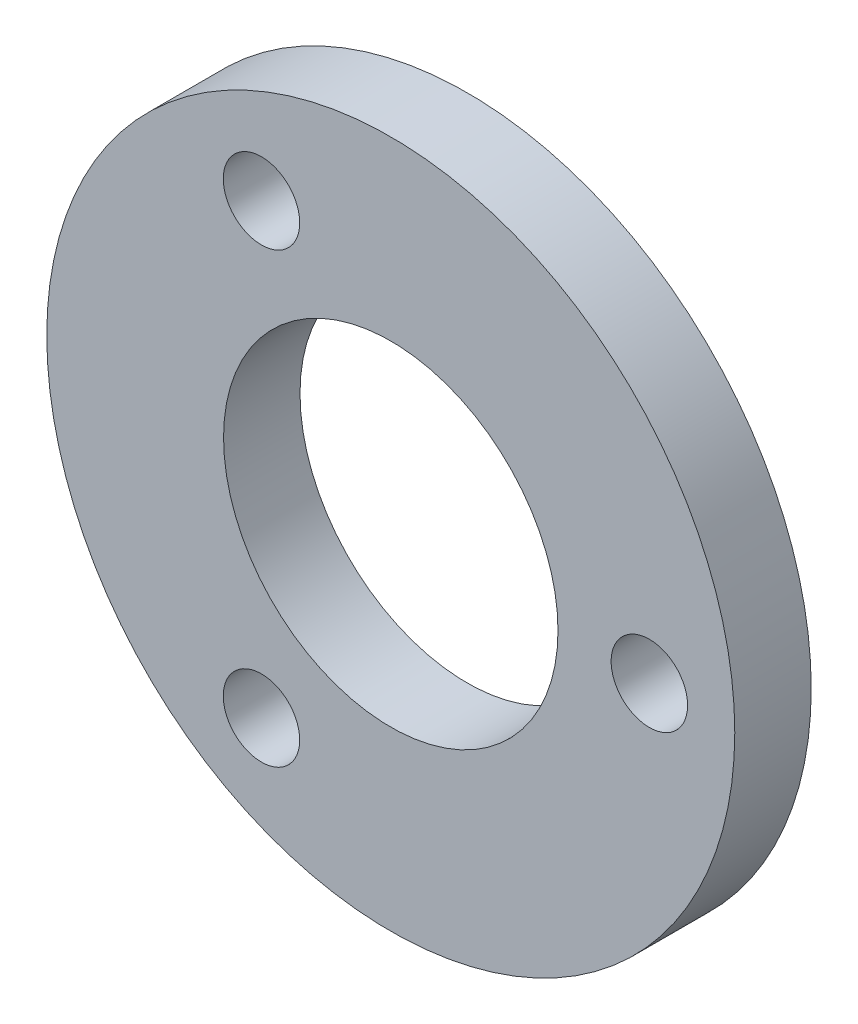
ISO-10303-21;
HEADER;
FILE_DESCRIPTION(('STEP AP214'),'2;1');
FILE_NAME('part.step','',(''),(''),'','','');
FILE_SCHEMA(('AUTOMOTIVE_DESIGN { 1 0 10303 214 1 1 1 1 }'));
ENDSEC;
DATA;
#1=APPLICATION_CONTEXT('core data for automotive mechanical design processes');
#2=APPLICATION_PROTOCOL_DEFINITION('international standard','automotive_design',2000,#1);
#3=PRODUCT_CONTEXT('',#1,'mechanical');
#4=PRODUCT('Part','Part','',(#3));
#5=PRODUCT_RELATED_PRODUCT_CATEGORY('part','',(#4));
#6=PRODUCT_DEFINITION_FORMATION('','',#4);
#7=PRODUCT_DEFINITION_CONTEXT('part definition',#1,'design');
#8=PRODUCT_DEFINITION('design','',#6,#7);
#9=PRODUCT_DEFINITION_SHAPE('','',#8);
#10=(LENGTH_UNIT() NAMED_UNIT(*) SI_UNIT(.MILLI.,.METRE.));
#11=(NAMED_UNIT(*) PLANE_ANGLE_UNIT() SI_UNIT($,.RADIAN.));
#12=(NAMED_UNIT(*) SI_UNIT($,.STERADIAN.) SOLID_ANGLE_UNIT());
#13=UNCERTAINTY_MEASURE_WITH_UNIT(LENGTH_MEASURE(1.E-05),#10,'distance_accuracy_value','');
#14=(GEOMETRIC_REPRESENTATION_CONTEXT(3) GLOBAL_UNCERTAINTY_ASSIGNED_CONTEXT((#13)) GLOBAL_UNIT_ASSIGNED_CONTEXT((#10,
#11,#12)) REPRESENTATION_CONTEXT('',''));
#15=CARTESIAN_POINT('',(0.,0.,0.));
#16=DIRECTION('',(0.,0.,1.));
#17=DIRECTION('',(1.,0.,0.));
#18=AXIS2_PLACEMENT_3D('',#15,#16,#17);
#19=CARTESIAN_POINT('',(-0.736666666666666,0.0914025565855618,4.));
#20=DIRECTION('',(0.,0.,1.));
#21=DIRECTION('',(1.,0.,0.));
#22=AXIS2_PLACEMENT_3D('',#19,#20,#21);
#23=PLANE('',#22);
#24=CARTESIAN_POINT('',(-7.50166666666672,-11.6259211566179,4.));
#25=DIRECTION('',(0.,0.,1.));
#26=DIRECTION('',(1.,0.,0.));
#27=AXIS2_PLACEMENT_3D('',#24,#25,#26);
#28=CIRCLE('',#27,2.);
#29=CARTESIAN_POINT('',(-5.50166666666673,-11.6259211566179,4.));
#30=VERTEX_POINT('',#29);
#31=EDGE_CURVE('E53',#30,#30,#28,.T.);
#32=ORIENTED_EDGE('',*,*,#31,.F.);
#33=EDGE_LOOP('',(#32));
#34=FACE_BOUND('',#33,.T.);
#35=CARTESIAN_POINT('',(12.7933333333333,0.0914025565855618,4.));
#36=DIRECTION('',(0.,0.,1.));
#37=DIRECTION('',(1.,0.,0.));
#38=AXIS2_PLACEMENT_3D('',#35,#36,#37);
#39=CIRCLE('',#38,2.);
#40=CARTESIAN_POINT('',(14.7933333333333,0.0914025565855618,4.));
#41=VERTEX_POINT('',#40);
#42=EDGE_CURVE('E42',#41,#41,#39,.T.);
#43=ORIENTED_EDGE('',*,*,#42,.F.);
#44=EDGE_LOOP('',(#43));
#45=FACE_BOUND('',#44,.T.);
#46=CARTESIAN_POINT('',(-0.736666666666666,0.0914025565855618,4.));
#47=DIRECTION('',(0.,0.,1.));
#48=DIRECTION('',(1.,0.,0.));
#49=AXIS2_PLACEMENT_3D('',#46,#47,#48);
#50=CIRCLE('',#49,18.);
#51=CARTESIAN_POINT('',(17.2633333333333,0.0914025565855618,4.));
#52=VERTEX_POINT('',#51);
#53=EDGE_CURVE('E10',#52,#52,#50,.T.);
#54=ORIENTED_EDGE('',*,*,#53,.T.);
#55=EDGE_LOOP('',(#54));
#56=FACE_BOUND('',#55,.T.);
#57=CARTESIAN_POINT('',(-0.736666666666666,0.0914025565855618,4.));
#58=DIRECTION('',(0.,0.,1.));
#59=DIRECTION('',(1.,0.,0.));
#60=AXIS2_PLACEMENT_3D('',#57,#58,#59);
#61=CIRCLE('',#60,8.75);
#62=CARTESIAN_POINT('',(8.01333333333334,0.0914025565855618,4.));
#63=VERTEX_POINT('',#62);
#64=EDGE_CURVE('E47',#63,#63,#61,.T.);
#65=ORIENTED_EDGE('',*,*,#64,.F.);
#66=EDGE_LOOP('',(#65));
#67=FACE_BOUND('',#66,.T.);
#68=CARTESIAN_POINT('',(-7.50166666666656,11.8087262697891,4.));
#69=DIRECTION('',(0.,0.,1.));
#70=DIRECTION('',(1.,0.,0.));
#71=AXIS2_PLACEMENT_3D('',#68,#69,#70);
#72=CIRCLE('',#71,2.);
#73=CARTESIAN_POINT('',(-5.50166666666656,11.8087262697891,4.));
#74=VERTEX_POINT('',#73);
#75=EDGE_CURVE('E59',#74,#74,#72,.T.);
#76=ORIENTED_EDGE('',*,*,#75,.F.);
#77=EDGE_LOOP('',(#76));
#78=FACE_BOUND('',#77,.T.);
#79=ADVANCED_FACE('F31',(#34,#45,#56,#67,#78),#23,.T.);
#80=CARTESIAN_POINT('',(-0.736666666666666,0.0914025565855618,0.));
#81=DIRECTION('',(0.,0.,1.));
#82=DIRECTION('',(1.,0.,0.));
#83=AXIS2_PLACEMENT_3D('',#80,#81,#82);
#84=PLANE('',#83);
#85=CARTESIAN_POINT('',(-0.736666666666666,0.0914025565855618,0.));
#86=DIRECTION('',(0.,0.,1.));
#87=DIRECTION('',(1.,0.,0.));
#88=AXIS2_PLACEMENT_3D('',#85,#86,#87);
#89=CIRCLE('',#88,18.);
#90=CARTESIAN_POINT('',(17.2633333333333,0.0914025565855618,0.));
#91=VERTEX_POINT('',#90);
#92=EDGE_CURVE('E35',#91,#91,#89,.T.);
#93=ORIENTED_EDGE('',*,*,#92,.F.);
#94=EDGE_LOOP('',(#93));
#95=FACE_BOUND('',#94,.T.);
#96=CARTESIAN_POINT('',(12.7933333333333,0.0914025565855618,0.));
#97=DIRECTION('',(0.,0.,1.));
#98=DIRECTION('',(1.,0.,0.));
#99=AXIS2_PLACEMENT_3D('',#96,#97,#98);
#100=CIRCLE('',#99,2.);
#101=CARTESIAN_POINT('',(14.7933333333333,0.0914025565855618,0.));
#102=VERTEX_POINT('',#101);
#103=EDGE_CURVE('E44',#102,#102,#100,.T.);
#104=ORIENTED_EDGE('',*,*,#103,.T.);
#105=EDGE_LOOP('',(#104));
#106=FACE_BOUND('',#105,.T.);
#107=CARTESIAN_POINT('',(-0.736666666666666,0.0914025565855618,0.));
#108=DIRECTION('',(0.,0.,1.));
#109=DIRECTION('',(1.,0.,0.));
#110=AXIS2_PLACEMENT_3D('',#107,#108,#109);
#111=CIRCLE('',#110,8.75);
#112=CARTESIAN_POINT('',(8.01333333333334,0.0914025565855618,0.));
#113=VERTEX_POINT('',#112);
#114=EDGE_CURVE('E50',#113,#113,#111,.T.);
#115=ORIENTED_EDGE('',*,*,#114,.T.);
#116=EDGE_LOOP('',(#115));
#117=FACE_BOUND('',#116,.T.);
#118=CARTESIAN_POINT('',(-7.50166666666672,-11.6259211566179,0.));
#119=DIRECTION('',(0.,0.,1.));
#120=DIRECTION('',(1.,0.,0.));
#121=AXIS2_PLACEMENT_3D('',#118,#119,#120);
#122=CIRCLE('',#121,2.);
#123=CARTESIAN_POINT('',(-5.50166666666673,-11.6259211566179,0.));
#124=VERTEX_POINT('',#123);
#125=EDGE_CURVE('E56',#124,#124,#122,.T.);
#126=ORIENTED_EDGE('',*,*,#125,.T.);
#127=EDGE_LOOP('',(#126));
#128=FACE_BOUND('',#127,.T.);
#129=CARTESIAN_POINT('',(-7.50166666666656,11.8087262697891,0.));
#130=DIRECTION('',(0.,0.,1.));
#131=DIRECTION('',(1.,0.,0.));
#132=AXIS2_PLACEMENT_3D('',#129,#130,#131);
#133=CIRCLE('',#132,2.);
#134=CARTESIAN_POINT('',(-5.50166666666656,11.8087262697891,0.));
#135=VERTEX_POINT('',#134);
#136=EDGE_CURVE('E62',#135,#135,#133,.T.);
#137=ORIENTED_EDGE('',*,*,#136,.T.);
#138=EDGE_LOOP('',(#137));
#139=FACE_BOUND('',#138,.T.);
#140=ADVANCED_FACE('F72',(#95,#106,#117,#128,#139),#84,.F.);
#141=CARTESIAN_POINT('',(-0.736666666666666,0.0914025565855618,4.));
#142=DIRECTION('',(0.,0.,-1.));
#143=DIRECTION('',(-1.,0.,0.));
#144=AXIS2_PLACEMENT_3D('',#141,#142,#143);
#145=CYLINDRICAL_SURFACE('',#144,18.);
#146=ORIENTED_EDGE('',*,*,#53,.F.);
#147=EDGE_LOOP('',(#146));
#148=FACE_BOUND('',#147,.T.);
#149=ORIENTED_EDGE('',*,*,#92,.T.);
#150=EDGE_LOOP('',(#149));
#151=FACE_BOUND('',#150,.T.);
#152=ADVANCED_FACE('F33',(#148,#151),#145,.T.);
#153=CARTESIAN_POINT('',(12.7933333333333,0.0914025565855618,4.));
#154=DIRECTION('',(0.,0.,-1.));
#155=DIRECTION('',(-1.,0.,0.));
#156=AXIS2_PLACEMENT_3D('',#153,#154,#155);
#157=CYLINDRICAL_SURFACE('',#156,2.);
#158=ORIENTED_EDGE('',*,*,#42,.T.);
#159=EDGE_LOOP('',(#158));
#160=FACE_BOUND('',#159,.T.);
#161=ORIENTED_EDGE('',*,*,#103,.F.);
#162=EDGE_LOOP('',(#161));
#163=FACE_BOUND('',#162,.T.);
#164=ADVANCED_FACE('F82',(#160,#163),#157,.F.);
#165=CARTESIAN_POINT('',(-0.736666666666666,0.0914025565855618,4.));
#166=DIRECTION('',(0.,0.,-1.));
#167=DIRECTION('',(-1.,0.,0.));
#168=AXIS2_PLACEMENT_3D('',#165,#166,#167);
#169=CYLINDRICAL_SURFACE('',#168,8.75);
#170=ORIENTED_EDGE('',*,*,#64,.T.);
#171=EDGE_LOOP('',(#170));
#172=FACE_BOUND('',#171,.T.);
#173=ORIENTED_EDGE('',*,*,#114,.F.);
#174=EDGE_LOOP('',(#173));
#175=FACE_BOUND('',#174,.T.);
#176=ADVANCED_FACE('F85',(#172,#175),#169,.F.);
#177=CARTESIAN_POINT('',(-7.50166666666672,-11.6259211566179,4.));
#178=DIRECTION('',(0.,0.,-1.));
#179=DIRECTION('',(-1.,0.,0.));
#180=AXIS2_PLACEMENT_3D('',#177,#178,#179);
#181=CYLINDRICAL_SURFACE('',#180,2.);
#182=ORIENTED_EDGE('',*,*,#31,.T.);
#183=EDGE_LOOP('',(#182));
#184=FACE_BOUND('',#183,.T.);
#185=ORIENTED_EDGE('',*,*,#125,.F.);
#186=EDGE_LOOP('',(#185));
#187=FACE_BOUND('',#186,.T.);
#188=ADVANCED_FACE('F89',(#184,#187),#181,.F.);
#189=CARTESIAN_POINT('',(-7.50166666666656,11.8087262697891,4.));
#190=DIRECTION('',(0.,0.,-1.));
#191=DIRECTION('',(-1.,0.,0.));
#192=AXIS2_PLACEMENT_3D('',#189,#190,#191);
#193=CYLINDRICAL_SURFACE('',#192,2.);
#194=ORIENTED_EDGE('',*,*,#75,.T.);
#195=EDGE_LOOP('',(#194));
#196=FACE_BOUND('',#195,.T.);
#197=ORIENTED_EDGE('',*,*,#136,.F.);
#198=EDGE_LOOP('',(#197));
#199=FACE_BOUND('',#198,.T.);
#200=ADVANCED_FACE('F68',(#196,#199),#193,.F.);
#201=CLOSED_SHELL('',(#79,#140,#152,#164,#176,#188,#200));
#202=MANIFOLD_SOLID_BREP('B2',#201);
#203=ADVANCED_BREP_SHAPE_REPRESENTATION('',(#18,#202),#14);
#204=SHAPE_DEFINITION_REPRESENTATION(#9,#203);
ENDSEC;
END-ISO-10303-21;
